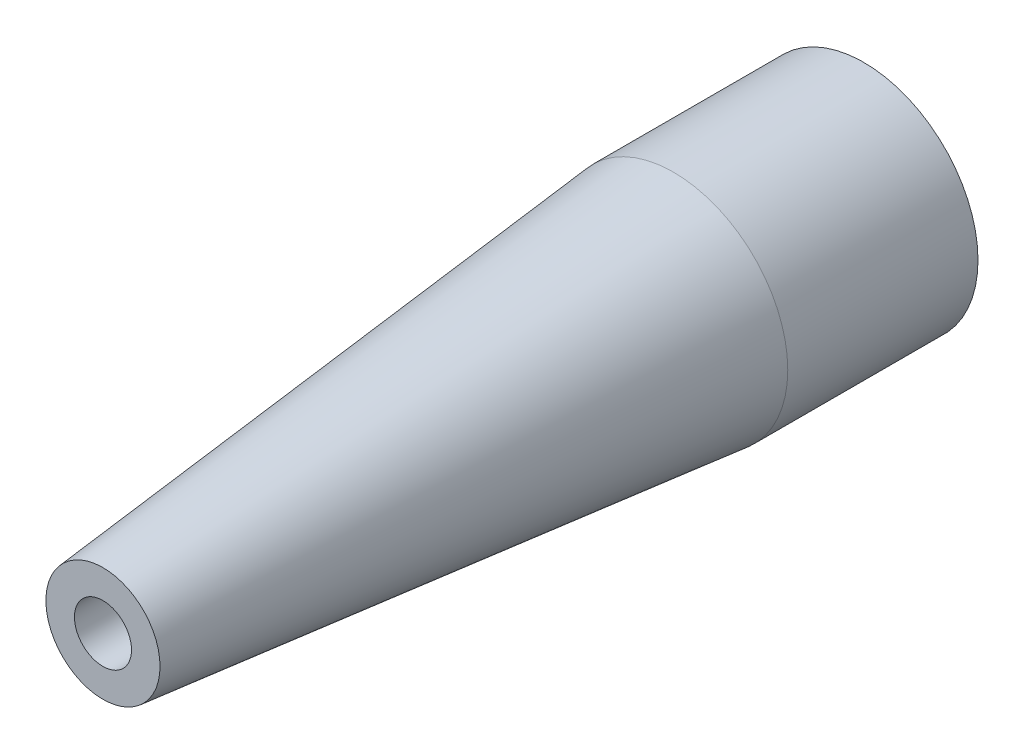
ISO-10303-21;
HEADER;
FILE_DESCRIPTION(('STEP AP214'),'2;1');
FILE_NAME('part.step','',(''),(''),'','','');
FILE_SCHEMA(('AUTOMOTIVE_DESIGN { 1 0 10303 214 1 1 1 1 }'));
ENDSEC;
DATA;
#1=APPLICATION_CONTEXT('core data for automotive mechanical design processes');
#2=APPLICATION_PROTOCOL_DEFINITION('international standard','automotive_design',2000,#1);
#3=PRODUCT_CONTEXT('',#1,'mechanical');
#4=PRODUCT('Part','Part','',(#3));
#5=PRODUCT_RELATED_PRODUCT_CATEGORY('part','',(#4));
#6=PRODUCT_DEFINITION_FORMATION('','',#4);
#7=PRODUCT_DEFINITION_CONTEXT('part definition',#1,'design');
#8=PRODUCT_DEFINITION('design','',#6,#7);
#9=PRODUCT_DEFINITION_SHAPE('','',#8);
#10=(LENGTH_UNIT() NAMED_UNIT(*) SI_UNIT(.MILLI.,.METRE.));
#11=(NAMED_UNIT(*) PLANE_ANGLE_UNIT() SI_UNIT($,.RADIAN.));
#12=(NAMED_UNIT(*) SI_UNIT($,.STERADIAN.) SOLID_ANGLE_UNIT());
#13=UNCERTAINTY_MEASURE_WITH_UNIT(LENGTH_MEASURE(1.E-05),#10,'distance_accuracy_value','');
#14=(GEOMETRIC_REPRESENTATION_CONTEXT(3) GLOBAL_UNCERTAINTY_ASSIGNED_CONTEXT((#13)) GLOBAL_UNIT_ASSIGNED_CONTEXT((#10,
#11,#12)) REPRESENTATION_CONTEXT('',''));
#15=CARTESIAN_POINT('',(0.,0.,0.));
#16=DIRECTION('',(0.,0.,1.));
#17=DIRECTION('',(1.,0.,0.));
#18=AXIS2_PLACEMENT_3D('',#15,#16,#17);
#19=CARTESIAN_POINT('',(0.,0.,20.));
#20=DIRECTION('',(0.,0.,1.));
#21=DIRECTION('',(1.,0.,0.));
#22=AXIS2_PLACEMENT_3D('',#19,#20,#21);
#23=PLANE('',#22);
#24=CARTESIAN_POINT('',(0.,0.,20.));
#25=DIRECTION('',(0.,0.,1.));
#26=DIRECTION('',(1.,0.,0.));
#27=AXIS2_PLACEMENT_3D('',#24,#25,#26);
#28=CIRCLE('',#27,1.5);
#29=CARTESIAN_POINT('',(1.5,0.,20.));
#30=VERTEX_POINT('',#29);
#31=EDGE_CURVE('E38',#30,#30,#28,.T.);
#32=ORIENTED_EDGE('',*,*,#31,.T.);
#33=EDGE_LOOP('',(#32));
#34=FACE_BOUND('',#33,.T.);
#35=CARTESIAN_POINT('',(0.,0.,20.));
#36=DIRECTION('',(0.,0.,1.));
#37=DIRECTION('',(1.,0.,0.));
#38=AXIS2_PLACEMENT_3D('',#35,#36,#37);
#39=CIRCLE('',#38,0.75);
#40=CARTESIAN_POINT('',(0.75,0.,20.));
#41=VERTEX_POINT('',#40);
#42=EDGE_CURVE('E46',#41,#41,#39,.T.);
#43=ORIENTED_EDGE('',*,*,#42,.F.);
#44=EDGE_LOOP('',(#43));
#45=FACE_BOUND('',#44,.T.);
#46=ADVANCED_FACE('F31',(#34,#45),#23,.T.);
#47=CARTESIAN_POINT('',(0.,0.,0.));
#48=DIRECTION('',(0.,0.,1.));
#49=DIRECTION('',(1.,0.,0.));
#50=AXIS2_PLACEMENT_3D('',#47,#48,#49);
#51=PLANE('',#50);
#52=CARTESIAN_POINT('',(0.,0.,0.));
#53=DIRECTION('',(0.,0.,1.));
#54=DIRECTION('',(1.,0.,0.));
#55=AXIS2_PLACEMENT_3D('',#52,#53,#54);
#56=CIRCLE('',#55,3.);
#57=CARTESIAN_POINT('',(3.,0.,0.));
#58=VERTEX_POINT('',#57);
#59=EDGE_CURVE('E42',#58,#58,#56,.T.);
#60=ORIENTED_EDGE('',*,*,#59,.F.);
#61=EDGE_LOOP('',(#60));
#62=FACE_BOUND('',#61,.T.);
#63=CARTESIAN_POINT('',(0.,0.,0.));
#64=DIRECTION('',(0.,0.,1.));
#65=DIRECTION('',(1.,0.,0.));
#66=AXIS2_PLACEMENT_3D('',#63,#64,#65);
#67=CIRCLE('',#66,0.75);
#68=CARTESIAN_POINT('',(0.75,0.,0.));
#69=VERTEX_POINT('',#68);
#70=EDGE_CURVE('E49',#69,#69,#67,.T.);
#71=ORIENTED_EDGE('',*,*,#70,.T.);
#72=EDGE_LOOP('',(#71));
#73=FACE_BOUND('',#72,.T.);
#74=ADVANCED_FACE('F59',(#62,#73),#51,.F.);
#75=CARTESIAN_POINT('',(0.,0.,20.));
#76=DIRECTION('',(0.,0.,-1.));
#77=DIRECTION('',(-1.,0.,0.));
#78=AXIS2_PLACEMENT_3D('',#75,#76,#77);
#79=CYLINDRICAL_SURFACE('',#78,3.);
#80=CARTESIAN_POINT('',(0.,0.,4.99999999999946));
#81=DIRECTION('',(0.,0.,1.));
#82=DIRECTION('',(1.,0.,0.));
#83=AXIS2_PLACEMENT_3D('',#80,#81,#82);
#84=CIRCLE('',#83,3.);
#85=CARTESIAN_POINT('',(3.,0.,4.99999999999946));
#86=VERTEX_POINT('',#85);
#87=EDGE_CURVE('E10',#86,#86,#84,.F.);
#88=ORIENTED_EDGE('',*,*,#87,.T.);
#89=EDGE_LOOP('',(#88));
#90=FACE_BOUND('',#89,.T.);
#91=ORIENTED_EDGE('',*,*,#59,.T.);
#92=EDGE_LOOP('',(#91));
#93=FACE_BOUND('',#92,.T.);
#94=ADVANCED_FACE('F64',(#90,#93),#79,.T.);
#95=CARTESIAN_POINT('',(0.,0.,20.));
#96=DIRECTION('',(0.,0.,-1.));
#97=DIRECTION('',(-1.,0.,0.));
#98=AXIS2_PLACEMENT_3D('',#95,#96,#97);
#99=CYLINDRICAL_SURFACE('',#98,0.75);
#100=ORIENTED_EDGE('',*,*,#42,.T.);
#101=EDGE_LOOP('',(#100));
#102=FACE_BOUND('',#101,.T.);
#103=ORIENTED_EDGE('',*,*,#70,.F.);
#104=EDGE_LOOP('',(#103));
#105=FACE_BOUND('',#104,.T.);
#106=ADVANCED_FACE('F55',(#102,#105),#99,.F.);
#107=CARTESIAN_POINT('',(0.,0.,20.));
#108=DIRECTION('',(0.,0.,-1.));
#109=DIRECTION('',(-1.,0.,0.));
#110=AXIS2_PLACEMENT_3D('',#107,#108,#109);
#111=CONICAL_SURFACE('',#110,1.5,0.0996686524911587);
#112=ORIENTED_EDGE('',*,*,#87,.F.);
#113=EDGE_LOOP('',(#112));
#114=FACE_BOUND('',#113,.T.);
#115=ORIENTED_EDGE('',*,*,#31,.F.);
#116=EDGE_LOOP('',(#115));
#117=FACE_BOUND('',#116,.T.);
#118=ADVANCED_FACE('F33',(#114,#117),#111,.T.);
#119=CLOSED_SHELL('',(#46,#74,#94,#106,#118));
#120=MANIFOLD_SOLID_BREP('B2',#119);
#121=ADVANCED_BREP_SHAPE_REPRESENTATION('',(#18,#120),#14);
#122=SHAPE_DEFINITION_REPRESENTATION(#9,#121);
ENDSEC;
END-ISO-10303-21;
